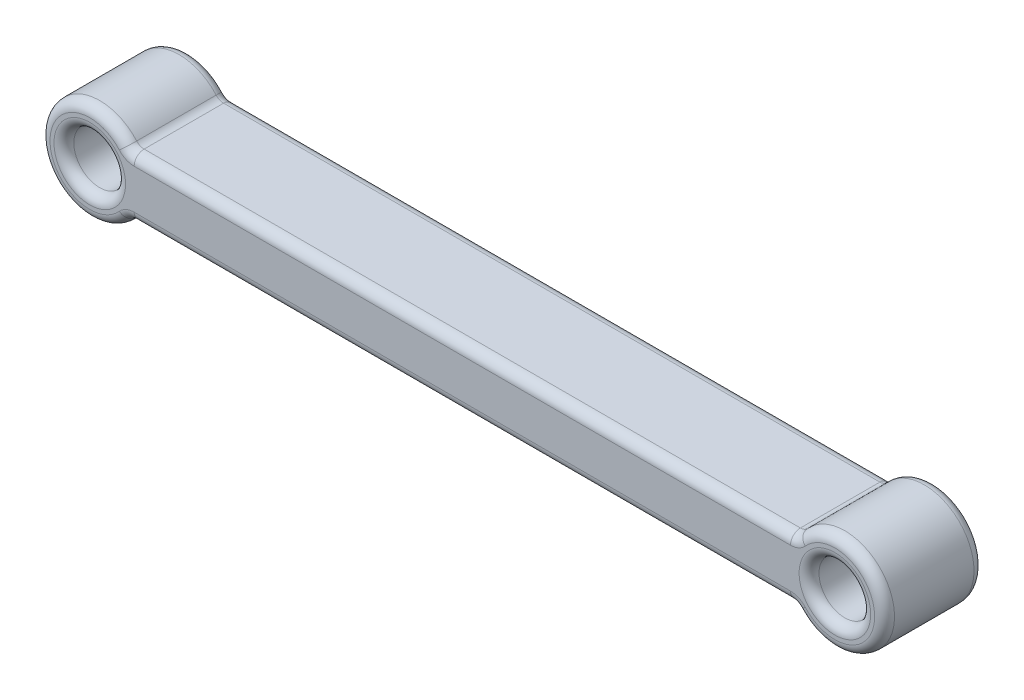
ISO-10303-21;
HEADER;
FILE_DESCRIPTION(('STEP AP214'),'2;1');
FILE_NAME('part.step','',(''),(''),'','','');
FILE_SCHEMA(('AUTOMOTIVE_DESIGN { 1 0 10303 214 1 1 1 1 }'));
ENDSEC;
DATA;
#1=APPLICATION_CONTEXT('core data for automotive mechanical design processes');
#2=APPLICATION_PROTOCOL_DEFINITION('international standard','automotive_design',2000,#1);
#3=PRODUCT_CONTEXT('',#1,'mechanical');
#4=PRODUCT('Part','Part','',(#3));
#5=PRODUCT_RELATED_PRODUCT_CATEGORY('part','',(#4));
#6=PRODUCT_DEFINITION_FORMATION('','',#4);
#7=PRODUCT_DEFINITION_CONTEXT('part definition',#1,'design');
#8=PRODUCT_DEFINITION('design','',#6,#7);
#9=PRODUCT_DEFINITION_SHAPE('','',#8);
#10=(LENGTH_UNIT() NAMED_UNIT(*) SI_UNIT(.MILLI.,.METRE.));
#11=(NAMED_UNIT(*) PLANE_ANGLE_UNIT() SI_UNIT($,.RADIAN.));
#12=(NAMED_UNIT(*) SI_UNIT($,.STERADIAN.) SOLID_ANGLE_UNIT());
#13=UNCERTAINTY_MEASURE_WITH_UNIT(LENGTH_MEASURE(1.E-05),#10,'distance_accuracy_value','');
#14=(GEOMETRIC_REPRESENTATION_CONTEXT(3) GLOBAL_UNCERTAINTY_ASSIGNED_CONTEXT((#13)) GLOBAL_UNIT_ASSIGNED_CONTEXT((#10,
#11,#12)) REPRESENTATION_CONTEXT('',''));
#15=CARTESIAN_POINT('',(0.,0.,0.));
#16=DIRECTION('',(0.,0.,1.));
#17=DIRECTION('',(1.,0.,0.));
#18=AXIS2_PLACEMENT_3D('',#15,#16,#17);
#19=CARTESIAN_POINT('',(-75.,0.,10.));
#20=DIRECTION('',(0.,0.,1.));
#21=DIRECTION('',(1.,0.,0.));
#22=AXIS2_PLACEMENT_3D('',#19,#20,#21);
#23=PLANE('',#22);
#24=CARTESIAN_POINT('',(0.,0.,10.));
#25=DIRECTION('',(0.,0.,1.));
#26=DIRECTION('',(1.,0.,0.));
#27=AXIS2_PLACEMENT_3D('',#24,#25,#26);
#28=CIRCLE('',#27,3.6);
#29=CARTESIAN_POINT('',(3.6,0.,10.));
#30=VERTEX_POINT('',#29);
#31=EDGE_CURVE('E11',#30,#30,#28,.F.);
#32=ORIENTED_EDGE('',*,*,#31,.T.);
#33=EDGE_LOOP('',(#32));
#34=FACE_BOUND('',#33,.T.);
#35=CARTESIAN_POINT('',(-4.47213595499957,-4.00000000000001,10.));
#36=DIRECTION('',(0.,0.,1.));
#37=DIRECTION('',(1.,0.,0.));
#38=AXIS2_PLACEMENT_3D('',#35,#36,#37);
#39=CIRCLE('',#38,2.);
#40=CARTESIAN_POINT('',(-2.98142396999971,-2.66666666666667,10.));
#41=VERTEX_POINT('',#40);
#42=CARTESIAN_POINT('',(-4.47213595499957,-2.00000000000001,10.));
#43=VERTEX_POINT('',#42);
#44=EDGE_CURVE('E63',#41,#43,#39,.T.);
#45=ORIENTED_EDGE('',*,*,#44,.F.);
#46=CARTESIAN_POINT('',(0.,0.,10.));
#47=DIRECTION('',(0.,0.,1.));
#48=DIRECTION('',(1.,0.,0.));
#49=AXIS2_PLACEMENT_3D('',#46,#47,#48);
#50=CIRCLE('',#49,4.);
#51=CARTESIAN_POINT('',(-2.98142396999972,2.66666666666666,10.));
#52=VERTEX_POINT('',#51);
#53=EDGE_CURVE('E51',#41,#52,#50,.T.);
#54=ORIENTED_EDGE('',*,*,#53,.T.);
#55=CARTESIAN_POINT('',(-4.47213595499959,3.99999999999999,10.));
#56=DIRECTION('',(0.,0.,1.));
#57=DIRECTION('',(1.,0.,0.));
#58=AXIS2_PLACEMENT_3D('',#55,#56,#57);
#59=CIRCLE('',#58,2.);
#60=CARTESIAN_POINT('',(-4.47213595499959,1.99999999999999,10.));
#61=VERTEX_POINT('',#60);
#62=EDGE_CURVE('E319',#61,#52,#59,.T.);
#63=ORIENTED_EDGE('',*,*,#62,.F.);
#64=DIRECTION('',(-1.,0.,0.));
#65=VECTOR('',#64,1.);
#66=CARTESIAN_POINT('',(-71.,1.99999999999999,10.));
#67=LINE('',#66,#65);
#68=CARTESIAN_POINT('',(-70.5278640450004,1.99999999999999,10.));
#69=VERTEX_POINT('',#68);
#70=EDGE_CURVE('E314',#61,#69,#67,.T.);
#71=ORIENTED_EDGE('',*,*,#70,.T.);
#72=CARTESIAN_POINT('',(-70.5278640450004,3.99999999999999,10.));
#73=DIRECTION('',(0.,0.,1.));
#74=DIRECTION('',(1.,0.,0.));
#75=AXIS2_PLACEMENT_3D('',#72,#73,#74);
#76=CIRCLE('',#75,2.);
#77=CARTESIAN_POINT('',(-72.0185760300003,2.66666666666666,10.));
#78=VERTEX_POINT('',#77);
#79=EDGE_CURVE('E186',#78,#69,#76,.T.);
#80=ORIENTED_EDGE('',*,*,#79,.F.);
#81=CARTESIAN_POINT('',(-75.,0.,10.));
#82=DIRECTION('',(0.,0.,1.));
#83=DIRECTION('',(1.,0.,0.));
#84=AXIS2_PLACEMENT_3D('',#81,#82,#83);
#85=CIRCLE('',#84,4.);
#86=CARTESIAN_POINT('',(-72.0185760300003,-2.66666666666667,10.));
#87=VERTEX_POINT('',#86);
#88=EDGE_CURVE('E306',#78,#87,#85,.T.);
#89=ORIENTED_EDGE('',*,*,#88,.T.);
#90=CARTESIAN_POINT('',(-70.5278640450004,-4.00000000000001,10.));
#91=DIRECTION('',(0.,0.,1.));
#92=DIRECTION('',(1.,0.,0.));
#93=AXIS2_PLACEMENT_3D('',#90,#91,#92);
#94=CIRCLE('',#93,2.);
#95=CARTESIAN_POINT('',(-70.5278640450004,-2.00000000000001,10.));
#96=VERTEX_POINT('',#95);
#97=EDGE_CURVE('E302',#96,#87,#94,.T.);
#98=ORIENTED_EDGE('',*,*,#97,.F.);
#99=DIRECTION('',(1.,0.,0.));
#100=VECTOR('',#99,1.);
#101=CARTESIAN_POINT('',(-3.99999999999999,-2.00000000000001,10.));
#102=LINE('',#101,#100);
#103=EDGE_CURVE('E309',#96,#43,#102,.T.);
#104=ORIENTED_EDGE('',*,*,#103,.T.);
#105=EDGE_LOOP('',(#45,#54,#63,#71,#80,#89,#98,#104));
#106=FACE_BOUND('',#105,.T.);
#107=CARTESIAN_POINT('',(-75.,0.,10.));
#108=DIRECTION('',(0.,0.,1.));
#109=DIRECTION('',(1.,0.,0.));
#110=AXIS2_PLACEMENT_3D('',#107,#108,#109);
#111=CIRCLE('',#110,3.6);
#112=CARTESIAN_POINT('',(-71.4,0.,10.));
#113=VERTEX_POINT('',#112);
#114=EDGE_CURVE('E298',#113,#113,#111,.F.);
#115=ORIENTED_EDGE('',*,*,#114,.T.);
#116=EDGE_LOOP('',(#115));
#117=FACE_BOUND('',#116,.T.);
#118=ADVANCED_FACE('F41',(#34,#106,#117),#23,.T.);
#119=CARTESIAN_POINT('',(-75.,0.,0.));
#120=DIRECTION('',(0.,0.,1.));
#121=DIRECTION('',(1.,0.,0.));
#122=AXIS2_PLACEMENT_3D('',#119,#120,#121);
#123=PLANE('',#122);
#124=CARTESIAN_POINT('',(0.,0.,0.));
#125=DIRECTION('',(0.,0.,1.));
#126=DIRECTION('',(1.,0.,0.));
#127=AXIS2_PLACEMENT_3D('',#124,#125,#126);
#128=CIRCLE('',#127,3.6);
#129=CARTESIAN_POINT('',(3.6,0.,0.));
#130=VERTEX_POINT('',#129);
#131=EDGE_CURVE('E278',#130,#130,#128,.T.);
#132=ORIENTED_EDGE('',*,*,#131,.T.);
#133=EDGE_LOOP('',(#132));
#134=FACE_BOUND('',#133,.T.);
#135=CARTESIAN_POINT('',(-75.,0.,0.));
#136=DIRECTION('',(0.,0.,1.));
#137=DIRECTION('',(1.,0.,0.));
#138=AXIS2_PLACEMENT_3D('',#135,#136,#137);
#139=CIRCLE('',#138,3.6);
#140=CARTESIAN_POINT('',(-71.4,0.,0.));
#141=VERTEX_POINT('',#140);
#142=EDGE_CURVE('E274',#141,#141,#139,.T.);
#143=ORIENTED_EDGE('',*,*,#142,.T.);
#144=EDGE_LOOP('',(#143));
#145=FACE_BOUND('',#144,.T.);
#146=CARTESIAN_POINT('',(-4.47213595499959,3.99999999999999,0.));
#147=DIRECTION('',(0.,0.,1.));
#148=DIRECTION('',(1.,0.,0.));
#149=AXIS2_PLACEMENT_3D('',#146,#147,#148);
#150=CIRCLE('',#149,2.);
#151=CARTESIAN_POINT('',(-2.98142396999972,2.66666666666666,0.));
#152=VERTEX_POINT('',#151);
#153=CARTESIAN_POINT('',(-4.47213595499959,1.99999999999999,0.));
#154=VERTEX_POINT('',#153);
#155=EDGE_CURVE('E263',#152,#154,#150,.F.);
#156=ORIENTED_EDGE('',*,*,#155,.F.);
#157=CARTESIAN_POINT('',(0.,0.,0.));
#158=DIRECTION('',(0.,0.,1.));
#159=DIRECTION('',(1.,0.,0.));
#160=AXIS2_PLACEMENT_3D('',#157,#158,#159);
#161=CIRCLE('',#160,4.);
#162=CARTESIAN_POINT('',(-2.98142396999971,-2.66666666666667,0.));
#163=VERTEX_POINT('',#162);
#164=EDGE_CURVE('E271',#152,#163,#161,.F.);
#165=ORIENTED_EDGE('',*,*,#164,.T.);
#166=CARTESIAN_POINT('',(-4.47213595499957,-4.00000000000001,0.));
#167=DIRECTION('',(0.,0.,1.));
#168=DIRECTION('',(1.,0.,0.));
#169=AXIS2_PLACEMENT_3D('',#166,#167,#168);
#170=CIRCLE('',#169,2.);
#171=CARTESIAN_POINT('',(-4.47213595499957,-2.00000000000001,0.));
#172=VERTEX_POINT('',#171);
#173=EDGE_CURVE('E267',#172,#163,#170,.F.);
#174=ORIENTED_EDGE('',*,*,#173,.F.);
#175=DIRECTION('',(1.,0.,0.));
#176=VECTOR('',#175,1.);
#177=CARTESIAN_POINT('',(-75.,-2.00000000000001,0.));
#178=LINE('',#177,#176);
#179=CARTESIAN_POINT('',(-70.5278640450004,-2.00000000000001,0.));
#180=VERTEX_POINT('',#179);
#181=EDGE_CURVE('E259',#172,#180,#178,.F.);
#182=ORIENTED_EDGE('',*,*,#181,.T.);
#183=CARTESIAN_POINT('',(-70.5278640450004,-4.00000000000001,0.));
#184=DIRECTION('',(0.,0.,1.));
#185=DIRECTION('',(1.,0.,0.));
#186=AXIS2_PLACEMENT_3D('',#183,#184,#185);
#187=CIRCLE('',#186,2.);
#188=CARTESIAN_POINT('',(-72.0185760300003,-2.66666666666667,0.));
#189=VERTEX_POINT('',#188);
#190=EDGE_CURVE('E255',#189,#180,#187,.F.);
#191=ORIENTED_EDGE('',*,*,#190,.F.);
#192=CARTESIAN_POINT('',(-75.,0.,0.));
#193=DIRECTION('',(0.,0.,1.));
#194=DIRECTION('',(1.,0.,0.));
#195=AXIS2_PLACEMENT_3D('',#192,#193,#194);
#196=CIRCLE('',#195,4.);
#197=CARTESIAN_POINT('',(-72.0185760300003,2.66666666666666,0.));
#198=VERTEX_POINT('',#197);
#199=EDGE_CURVE('E249',#189,#198,#196,.F.);
#200=ORIENTED_EDGE('',*,*,#199,.T.);
#201=CARTESIAN_POINT('',(-70.5278640450004,3.99999999999999,0.));
#202=DIRECTION('',(0.,0.,1.));
#203=DIRECTION('',(1.,0.,0.));
#204=AXIS2_PLACEMENT_3D('',#201,#202,#203);
#205=CIRCLE('',#204,2.);
#206=CARTESIAN_POINT('',(-70.5278640450004,1.99999999999999,0.));
#207=VERTEX_POINT('',#206);
#208=EDGE_CURVE('E245',#207,#198,#205,.F.);
#209=ORIENTED_EDGE('',*,*,#208,.F.);
#210=DIRECTION('',(-1.,0.,0.));
#211=VECTOR('',#210,1.);
#212=CARTESIAN_POINT('',(-75.,1.99999999999999,0.));
#213=LINE('',#212,#211);
#214=EDGE_CURVE('E252',#207,#154,#213,.F.);
#215=ORIENTED_EDGE('',*,*,#214,.T.);
#216=EDGE_LOOP('',(#156,#165,#174,#182,#191,#200,#209,#215));
#217=FACE_BOUND('',#216,.T.);
#218=ADVANCED_FACE('F408',(#134,#145,#217),#123,.F.);
#219=CARTESIAN_POINT('',(-75.,0.,10.));
#220=DIRECTION('',(0.,0.,-1.));
#221=DIRECTION('',(-1.,0.,0.));
#222=AXIS2_PLACEMENT_3D('',#219,#220,#221);
#223=CYLINDRICAL_SURFACE('',#222,5.);
#224=DIRECTION('',(0.,0.,-1.));
#225=VECTOR('',#224,1.);
#226=CARTESIAN_POINT('',(-71.2732200375003,3.33333333333332,10.));
#227=LINE('',#226,#225);
#228=CARTESIAN_POINT('',(-71.2732200375003,3.33333333333332,9.));
#229=VERTEX_POINT('',#228);
#230=CARTESIAN_POINT('',(-71.2732200375003,3.33333333333332,0.999999999999999));
#231=VERTEX_POINT('',#230);
#232=EDGE_CURVE('E175',#229,#231,#227,.T.);
#233=ORIENTED_EDGE('',*,*,#232,.T.);
#234=CARTESIAN_POINT('',(-75.,0.,0.999999999999999));
#235=DIRECTION('',(0.,0.,1.));
#236=DIRECTION('',(1.,0.,0.));
#237=AXIS2_PLACEMENT_3D('',#234,#235,#236);
#238=CIRCLE('',#237,5.);
#239=CARTESIAN_POINT('',(-71.2732200375004,-3.33333333333334,0.999999999999999));
#240=VERTEX_POINT('',#239);
#241=EDGE_CURVE('E229',#231,#240,#238,.T.);
#242=ORIENTED_EDGE('',*,*,#241,.T.);
#243=DIRECTION('',(0.,0.,-1.));
#244=VECTOR('',#243,1.);
#245=CARTESIAN_POINT('',(-71.2732200375004,-3.33333333333334,10.));
#246=LINE('',#245,#244);
#247=CARTESIAN_POINT('',(-71.2732200375004,-3.33333333333334,9.));
#248=VERTEX_POINT('',#247);
#249=EDGE_CURVE('E224',#240,#248,#246,.F.);
#250=ORIENTED_EDGE('',*,*,#249,.T.);
#251=CARTESIAN_POINT('',(-75.,0.,9.));
#252=DIRECTION('',(0.,0.,1.));
#253=DIRECTION('',(1.,0.,0.));
#254=AXIS2_PLACEMENT_3D('',#251,#252,#253);
#255=CIRCLE('',#254,5.);
#256=EDGE_CURVE('E221',#248,#229,#255,.F.);
#257=ORIENTED_EDGE('',*,*,#256,.T.);
#258=EDGE_LOOP('',(#233,#242,#250,#257));
#259=FACE_BOUND('',#258,.T.);
#260=ADVANCED_FACE('F439',(#259),#223,.T.);
#261=CARTESIAN_POINT('',(-71.,-3.00000000000001,10.));
#262=DIRECTION('',(0.,1.,0.));
#263=DIRECTION('',(0.,0.,1.));
#264=AXIS2_PLACEMENT_3D('',#261,#262,#263);
#265=PLANE('',#264);
#266=DIRECTION('',(0.,0.,1.));
#267=VECTOR('',#266,1.);
#268=CARTESIAN_POINT('',(-70.5278640450004,-3.00000000000001,0.));
#269=LINE('',#268,#267);
#270=CARTESIAN_POINT('',(-70.5278640450004,-3.00000000000001,9.));
#271=VERTEX_POINT('',#270);
#272=CARTESIAN_POINT('',(-70.5278640450004,-3.00000000000001,0.999999999999999));
#273=VERTEX_POINT('',#272);
#274=EDGE_CURVE('E238',#271,#273,#269,.F.);
#275=ORIENTED_EDGE('',*,*,#274,.T.);
#276=DIRECTION('',(1.,0.,0.));
#277=VECTOR('',#276,1.);
#278=CARTESIAN_POINT('',(-71.,-3.00000000000001,0.999999999999999));
#279=LINE('',#278,#277);
#280=CARTESIAN_POINT('',(-4.47213595499957,-3.00000000000001,0.999999999999999));
#281=VERTEX_POINT('',#280);
#282=EDGE_CURVE('E242',#273,#281,#279,.T.);
#283=ORIENTED_EDGE('',*,*,#282,.T.);
#284=DIRECTION('',(0.,0.,1.));
#285=VECTOR('',#284,1.);
#286=CARTESIAN_POINT('',(-4.47213595499957,-3.00000000000001,10.));
#287=LINE('',#286,#285);
#288=CARTESIAN_POINT('',(-4.47213595499957,-3.00000000000001,9.));
#289=VERTEX_POINT('',#288);
#290=EDGE_CURVE('E235',#281,#289,#287,.T.);
#291=ORIENTED_EDGE('',*,*,#290,.T.);
#292=DIRECTION('',(1.,0.,0.));
#293=VECTOR('',#292,1.);
#294=CARTESIAN_POINT('',(-71.,-3.00000000000001,9.));
#295=LINE('',#294,#293);
#296=EDGE_CURVE('E232',#289,#271,#295,.F.);
#297=ORIENTED_EDGE('',*,*,#296,.T.);
#298=EDGE_LOOP('',(#275,#283,#291,#297));
#299=FACE_BOUND('',#298,.T.);
#300=ADVANCED_FACE('F426',(#299),#265,.F.);
#301=CARTESIAN_POINT('',(0.,0.,10.));
#302=DIRECTION('',(0.,0.,-1.));
#303=DIRECTION('',(-1.,0.,0.));
#304=AXIS2_PLACEMENT_3D('',#301,#302,#303);
#305=CYLINDRICAL_SURFACE('',#304,5.);
#306=DIRECTION('',(0.,0.,-1.));
#307=VECTOR('',#306,1.);
#308=CARTESIAN_POINT('',(-3.72677996249964,-3.33333333333334,10.));
#309=LINE('',#308,#307);
#310=CARTESIAN_POINT('',(-3.72677996249964,-3.33333333333334,9.));
#311=VERTEX_POINT('',#310);
#312=CARTESIAN_POINT('',(-3.72677996249964,-3.33333333333334,0.999999999999999));
#313=VERTEX_POINT('',#312);
#314=EDGE_CURVE('E211',#311,#313,#309,.T.);
#315=ORIENTED_EDGE('',*,*,#314,.T.);
#316=CARTESIAN_POINT('',(0.,0.,0.999999999999999));
#317=DIRECTION('',(0.,0.,1.));
#318=DIRECTION('',(1.,0.,0.));
#319=AXIS2_PLACEMENT_3D('',#316,#317,#318);
#320=CIRCLE('',#319,5.);
#321=CARTESIAN_POINT('',(-3.72677996249966,3.33333333333333,0.999999999999999));
#322=VERTEX_POINT('',#321);
#323=EDGE_CURVE('E218',#313,#322,#320,.T.);
#324=ORIENTED_EDGE('',*,*,#323,.T.);
#325=DIRECTION('',(0.,0.,-1.));
#326=VECTOR('',#325,1.);
#327=CARTESIAN_POINT('',(-3.72677996249966,3.33333333333333,10.));
#328=LINE('',#327,#326);
#329=CARTESIAN_POINT('',(-3.72677996249966,3.33333333333333,9.));
#330=VERTEX_POINT('',#329);
#331=EDGE_CURVE('E214',#322,#330,#328,.F.);
#332=ORIENTED_EDGE('',*,*,#331,.T.);
#333=CARTESIAN_POINT('',(0.,0.,9.));
#334=DIRECTION('',(0.,0.,1.));
#335=DIRECTION('',(1.,0.,0.));
#336=AXIS2_PLACEMENT_3D('',#333,#334,#335);
#337=CIRCLE('',#336,5.);
#338=EDGE_CURVE('E208',#330,#311,#337,.F.);
#339=ORIENTED_EDGE('',*,*,#338,.T.);
#340=EDGE_LOOP('',(#315,#324,#332,#339));
#341=FACE_BOUND('',#340,.T.);
#342=ADVANCED_FACE('F484',(#341),#305,.T.);
#343=CARTESIAN_POINT('',(-71.,2.99999999999999,10.));
#344=DIRECTION('',(0.,-1.,0.));
#345=DIRECTION('',(0.,0.,-1.));
#346=AXIS2_PLACEMENT_3D('',#343,#344,#345);
#347=PLANE('',#346);
#348=DIRECTION('',(0.,0.,1.));
#349=VECTOR('',#348,1.);
#350=CARTESIAN_POINT('',(-4.47213595499959,2.99999999999999,0.));
#351=LINE('',#350,#349);
#352=CARTESIAN_POINT('',(-4.47213595499959,2.99999999999999,9.));
#353=VERTEX_POINT('',#352);
#354=CARTESIAN_POINT('',(-4.47213595499959,2.99999999999999,0.999999999999999));
#355=VERTEX_POINT('',#354);
#356=EDGE_CURVE('E167',#353,#355,#351,.F.);
#357=ORIENTED_EDGE('',*,*,#356,.T.);
#358=DIRECTION('',(-1.,0.,0.));
#359=VECTOR('',#358,1.);
#360=CARTESIAN_POINT('',(-71.,2.99999999999999,0.999999999999999));
#361=LINE('',#360,#359);
#362=CARTESIAN_POINT('',(-70.5278640450004,2.99999999999999,0.999999999999999));
#363=VERTEX_POINT('',#362);
#364=EDGE_CURVE('E162',#355,#363,#361,.T.);
#365=ORIENTED_EDGE('',*,*,#364,.T.);
#366=DIRECTION('',(0.,0.,1.));
#367=VECTOR('',#366,1.);
#368=CARTESIAN_POINT('',(-70.5278640450004,2.99999999999999,10.));
#369=LINE('',#368,#367);
#370=CARTESIAN_POINT('',(-70.5278640450004,2.99999999999999,9.));
#371=VERTEX_POINT('',#370);
#372=EDGE_CURVE('E154',#363,#371,#369,.T.);
#373=ORIENTED_EDGE('',*,*,#372,.T.);
#374=DIRECTION('',(-1.,0.,0.));
#375=VECTOR('',#374,1.);
#376=CARTESIAN_POINT('',(-4.,2.99999999999999,9.));
#377=LINE('',#376,#375);
#378=EDGE_CURVE('E159',#371,#353,#377,.F.);
#379=ORIENTED_EDGE('',*,*,#378,.T.);
#380=EDGE_LOOP('',(#357,#365,#373,#379));
#381=FACE_BOUND('',#380,.T.);
#382=ADVANCED_FACE('F157',(#381),#347,.F.);
#383=CARTESIAN_POINT('',(-75.,0.,10.));
#384=DIRECTION('',(0.,0.,-1.));
#385=DIRECTION('',(-1.,0.,0.));
#386=AXIS2_PLACEMENT_3D('',#383,#384,#385);
#387=CYLINDRICAL_SURFACE('',#386,2.6);
#388=CARTESIAN_POINT('',(-75.,0.,0.999999999999999));
#389=DIRECTION('',(0.,0.,1.));
#390=DIRECTION('',(1.,0.,0.));
#391=AXIS2_PLACEMENT_3D('',#388,#389,#390);
#392=CIRCLE('',#391,2.6);
#393=CARTESIAN_POINT('',(-72.4,0.,0.999999999999999));
#394=VERTEX_POINT('',#393);
#395=EDGE_CURVE('E294',#394,#394,#392,.F.);
#396=ORIENTED_EDGE('',*,*,#395,.T.);
#397=EDGE_LOOP('',(#396));
#398=FACE_BOUND('',#397,.T.);
#399=CARTESIAN_POINT('',(-75.,0.,9.));
#400=DIRECTION('',(0.,0.,1.));
#401=DIRECTION('',(1.,0.,0.));
#402=AXIS2_PLACEMENT_3D('',#399,#400,#401);
#403=CIRCLE('',#402,2.6);
#404=CARTESIAN_POINT('',(-72.4,0.,9.));
#405=VERTEX_POINT('',#404);
#406=EDGE_CURVE('E290',#405,#405,#403,.T.);
#407=ORIENTED_EDGE('',*,*,#406,.T.);
#408=EDGE_LOOP('',(#407));
#409=FACE_BOUND('',#408,.T.);
#410=ADVANCED_FACE('F479',(#398,#409),#387,.F.);
#411=CARTESIAN_POINT('',(0.,0.,10.));
#412=DIRECTION('',(0.,0.,-1.));
#413=DIRECTION('',(-1.,0.,0.));
#414=AXIS2_PLACEMENT_3D('',#411,#412,#413);
#415=CYLINDRICAL_SURFACE('',#414,2.6);
#416=CARTESIAN_POINT('',(0.,0.,0.999999999999999));
#417=DIRECTION('',(0.,0.,1.));
#418=DIRECTION('',(1.,0.,0.));
#419=AXIS2_PLACEMENT_3D('',#416,#417,#418);
#420=CIRCLE('',#419,2.6);
#421=CARTESIAN_POINT('',(2.6,0.,0.999999999999999));
#422=VERTEX_POINT('',#421);
#423=EDGE_CURVE('E286',#422,#422,#420,.F.);
#424=ORIENTED_EDGE('',*,*,#423,.T.);
#425=EDGE_LOOP('',(#424));
#426=FACE_BOUND('',#425,.T.);
#427=CARTESIAN_POINT('',(0.,0.,9.));
#428=DIRECTION('',(0.,0.,1.));
#429=DIRECTION('',(1.,0.,0.));
#430=AXIS2_PLACEMENT_3D('',#427,#428,#429);
#431=CIRCLE('',#430,2.6);
#432=CARTESIAN_POINT('',(2.6,0.,9.));
#433=VERTEX_POINT('',#432);
#434=EDGE_CURVE('E282',#433,#433,#431,.T.);
#435=ORIENTED_EDGE('',*,*,#434,.T.);
#436=EDGE_LOOP('',(#435));
#437=FACE_BOUND('',#436,.T.);
#438=ADVANCED_FACE('F535',(#426,#437),#415,.F.);
#439=CARTESIAN_POINT('',(-70.5278640450004,-4.00000000000001,10.));
#440=DIRECTION('',(0.,0.,-1.));
#441=DIRECTION('',(-1.,0.,0.));
#442=AXIS2_PLACEMENT_3D('',#439,#440,#441);
#443=CYLINDRICAL_SURFACE('',#442,1.);
#444=CARTESIAN_POINT('',(-70.5278640450004,-4.00000000000001,9.));
#445=DIRECTION('',(0.,0.,1.));
#446=DIRECTION('',(1.,0.,0.));
#447=AXIS2_PLACEMENT_3D('',#444,#445,#446);
#448=CIRCLE('',#447,1.);
#449=EDGE_CURVE('E45',#248,#271,#448,.F.);
#450=ORIENTED_EDGE('',*,*,#449,.F.);
#451=ORIENTED_EDGE('',*,*,#249,.F.);
#452=CARTESIAN_POINT('',(-70.5278640450004,-4.00000000000001,0.999999999999999));
#453=DIRECTION('',(0.,0.,1.));
#454=DIRECTION('',(1.,0.,0.));
#455=AXIS2_PLACEMENT_3D('',#452,#453,#454);
#456=CIRCLE('',#455,1.);
#457=EDGE_CURVE('E202',#273,#240,#456,.T.);
#458=ORIENTED_EDGE('',*,*,#457,.F.);
#459=ORIENTED_EDGE('',*,*,#274,.F.);
#460=EDGE_LOOP('',(#450,#451,#458,#459));
#461=FACE_BOUND('',#460,.T.);
#462=ADVANCED_FACE('F437',(#461),#443,.F.);
#463=CARTESIAN_POINT('',(-70.5278640450004,-4.00000000000001,9.));
#464=DIRECTION('',(0.,0.,1.));
#465=DIRECTION('',(1.,0.,0.));
#466=AXIS2_PLACEMENT_3D('',#463,#464,#465);
#467=TOROIDAL_SURFACE('',#466,2.,1.);
#468=CARTESIAN_POINT('',(-72.0185760300003,-2.66666666666667,9.));
#469=DIRECTION('',(0.666666666666665,0.745355992499931,0.));
#470=DIRECTION('',(-0.745355992499932,0.666666666666665,0.));
#471=AXIS2_PLACEMENT_3D('',#468,#469,#470);
#472=CIRCLE('',#471,1.);
#473=EDGE_CURVE('E385',#248,#87,#472,.F.);
#474=ORIENTED_EDGE('',*,*,#473,.F.);
#475=ORIENTED_EDGE('',*,*,#449,.T.);
#476=CARTESIAN_POINT('',(-70.5278640450004,-2.00000000000001,9.));
#477=DIRECTION('',(-1.,0.,0.));
#478=DIRECTION('',(0.,0.,1.));
#479=AXIS2_PLACEMENT_3D('',#476,#477,#478);
#480=CIRCLE('',#479,1.);
#481=EDGE_CURVE('E389',#96,#271,#480,.F.);
#482=ORIENTED_EDGE('',*,*,#481,.F.);
#483=ORIENTED_EDGE('',*,*,#97,.T.);
#484=EDGE_LOOP('',(#474,#475,#482,#483));
#485=FACE_BOUND('',#484,.T.);
#486=ADVANCED_FACE('F434',(#485),#467,.T.);
#487=CARTESIAN_POINT('',(-70.5278640450004,-4.00000000000001,0.999999999999999));
#488=DIRECTION('',(0.,0.,1.));
#489=DIRECTION('',(1.,0.,0.));
#490=AXIS2_PLACEMENT_3D('',#487,#488,#489);
#491=TOROIDAL_SURFACE('',#490,2.,1.);
#492=CARTESIAN_POINT('',(-70.5278640450004,-2.00000000000001,1.));
#493=DIRECTION('',(-1.,0.,0.));
#494=DIRECTION('',(0.,0.,1.));
#495=AXIS2_PLACEMENT_3D('',#492,#493,#494);
#496=CIRCLE('',#495,1.);
#497=EDGE_CURVE('E378',#273,#180,#496,.F.);
#498=ORIENTED_EDGE('',*,*,#497,.F.);
#499=ORIENTED_EDGE('',*,*,#457,.T.);
#500=CARTESIAN_POINT('',(-72.0185760300003,-2.66666666666667,0.999999999999999));
#501=DIRECTION('',(0.666666666666666,0.745355992499931,0.));
#502=DIRECTION('',(-0.745355992499931,0.666666666666666,0.));
#503=AXIS2_PLACEMENT_3D('',#500,#501,#502);
#504=CIRCLE('',#503,1.);
#505=EDGE_CURVE('E381',#189,#240,#504,.F.);
#506=ORIENTED_EDGE('',*,*,#505,.F.);
#507=ORIENTED_EDGE('',*,*,#190,.T.);
#508=EDGE_LOOP('',(#498,#499,#506,#507));
#509=FACE_BOUND('',#508,.T.);
#510=ADVANCED_FACE('F398',(#509),#491,.T.);
#511=CARTESIAN_POINT('',(-75.,-2.00000000000001,9.));
#512=DIRECTION('',(-1.,0.,0.));
#513=DIRECTION('',(0.,0.,1.));
#514=AXIS2_PLACEMENT_3D('',#511,#512,#513);
#515=CYLINDRICAL_SURFACE('',#514,1.);
#516=ORIENTED_EDGE('',*,*,#481,.T.);
#517=ORIENTED_EDGE('',*,*,#296,.F.);
#518=CARTESIAN_POINT('',(-4.47213595499957,-2.00000000000001,9.));
#519=DIRECTION('',(1.,0.,0.));
#520=DIRECTION('',(0.,0.,-1.));
#521=AXIS2_PLACEMENT_3D('',#518,#519,#520);
#522=CIRCLE('',#521,1.);
#523=EDGE_CURVE('E370',#43,#289,#522,.T.);
#524=ORIENTED_EDGE('',*,*,#523,.F.);
#525=ORIENTED_EDGE('',*,*,#103,.F.);
#526=EDGE_LOOP('',(#516,#517,#524,#525));
#527=FACE_BOUND('',#526,.T.);
#528=ADVANCED_FACE('F429',(#527),#515,.T.);
#529=CARTESIAN_POINT('',(-75.,0.,9.));
#530=DIRECTION('',(0.,0.,1.));
#531=DIRECTION('',(1.,0.,0.));
#532=AXIS2_PLACEMENT_3D('',#529,#530,#531);
#533=TOROIDAL_SURFACE('',#532,4.,1.);
#534=ORIENTED_EDGE('',*,*,#473,.T.);
#535=ORIENTED_EDGE('',*,*,#88,.F.);
#536=CARTESIAN_POINT('',(-72.0185760300003,2.66666666666666,9.));
#537=DIRECTION('',(0.666666666666664,-0.745355992499932,0.));
#538=DIRECTION('',(0.745355992499932,0.666666666666664,0.));
#539=AXIS2_PLACEMENT_3D('',#536,#537,#538);
#540=CIRCLE('',#539,1.);
#541=EDGE_CURVE('E180',#229,#78,#540,.T.);
#542=ORIENTED_EDGE('',*,*,#541,.F.);
#543=ORIENTED_EDGE('',*,*,#256,.F.);
#544=EDGE_LOOP('',(#534,#535,#542,#543));
#545=FACE_BOUND('',#544,.T.);
#546=ADVANCED_FACE('F441',(#545),#533,.T.);
#547=CARTESIAN_POINT('',(-70.5278640450004,3.99999999999999,10.));
#548=DIRECTION('',(0.,0.,-1.));
#549=DIRECTION('',(-1.,0.,0.));
#550=AXIS2_PLACEMENT_3D('',#547,#548,#549);
#551=CYLINDRICAL_SURFACE('',#550,1.);
#552=CARTESIAN_POINT('',(-70.5278640450004,3.99999999999999,0.999999999999999));
#553=DIRECTION('',(0.,0.,1.));
#554=DIRECTION('',(1.,0.,0.));
#555=AXIS2_PLACEMENT_3D('',#552,#553,#554);
#556=CIRCLE('',#555,1.);
#557=EDGE_CURVE('E181',#231,#363,#556,.T.);
#558=ORIENTED_EDGE('',*,*,#557,.F.);
#559=ORIENTED_EDGE('',*,*,#232,.F.);
#560=CARTESIAN_POINT('',(-70.5278640450004,3.99999999999999,9.));
#561=DIRECTION('',(0.,0.,1.));
#562=DIRECTION('',(1.,0.,0.));
#563=AXIS2_PLACEMENT_3D('',#560,#561,#562);
#564=CIRCLE('',#563,1.);
#565=EDGE_CURVE('E171',#371,#229,#564,.F.);
#566=ORIENTED_EDGE('',*,*,#565,.F.);
#567=ORIENTED_EDGE('',*,*,#372,.F.);
#568=EDGE_LOOP('',(#558,#559,#566,#567));
#569=FACE_BOUND('',#568,.T.);
#570=ADVANCED_FACE('F173',(#569),#551,.F.);
#571=CARTESIAN_POINT('',(-75.,0.,0.999999999999999));
#572=DIRECTION('',(0.,0.,1.));
#573=DIRECTION('',(1.,0.,0.));
#574=AXIS2_PLACEMENT_3D('',#571,#572,#573);
#575=TOROIDAL_SURFACE('',#574,4.,1.);
#576=ORIENTED_EDGE('',*,*,#505,.T.);
#577=ORIENTED_EDGE('',*,*,#241,.F.);
#578=CARTESIAN_POINT('',(-72.0185760300003,2.66666666666666,1.));
#579=DIRECTION('',(0.666666666666664,-0.745355992499933,0.));
#580=DIRECTION('',(0.745355992499933,0.666666666666664,0.));
#581=AXIS2_PLACEMENT_3D('',#578,#579,#580);
#582=CIRCLE('',#581,1.);
#583=EDGE_CURVE('E363',#198,#231,#582,.T.);
#584=ORIENTED_EDGE('',*,*,#583,.F.);
#585=ORIENTED_EDGE('',*,*,#199,.F.);
#586=EDGE_LOOP('',(#576,#577,#584,#585));
#587=FACE_BOUND('',#586,.T.);
#588=ADVANCED_FACE('F405',(#587),#575,.T.);
#589=CARTESIAN_POINT('',(-71.,-2.00000000000001,0.999999999999999));
#590=DIRECTION('',(1.,0.,0.));
#591=DIRECTION('',(0.,0.,-1.));
#592=AXIS2_PLACEMENT_3D('',#589,#590,#591);
#593=CYLINDRICAL_SURFACE('',#592,1.);
#594=ORIENTED_EDGE('',*,*,#497,.T.);
#595=ORIENTED_EDGE('',*,*,#181,.F.);
#596=CARTESIAN_POINT('',(-4.47213595499957,-2.00000000000001,0.999999999999999));
#597=DIRECTION('',(1.,0.,0.));
#598=DIRECTION('',(0.,0.,-1.));
#599=AXIS2_PLACEMENT_3D('',#596,#597,#598);
#600=CIRCLE('',#599,1.);
#601=EDGE_CURVE('E359',#281,#172,#600,.T.);
#602=ORIENTED_EDGE('',*,*,#601,.F.);
#603=ORIENTED_EDGE('',*,*,#282,.F.);
#604=EDGE_LOOP('',(#594,#595,#602,#603));
#605=FACE_BOUND('',#604,.T.);
#606=ADVANCED_FACE('F413',(#605),#593,.T.);
#607=CARTESIAN_POINT('',(-4.47213595499957,-4.00000000000001,10.));
#608=DIRECTION('',(0.,0.,-1.));
#609=DIRECTION('',(-1.,0.,0.));
#610=AXIS2_PLACEMENT_3D('',#607,#608,#609);
#611=CYLINDRICAL_SURFACE('',#610,1.);
#612=CARTESIAN_POINT('',(-4.47213595499957,-4.00000000000001,9.));
#613=DIRECTION('',(0.,0.,1.));
#614=DIRECTION('',(1.,0.,0.));
#615=AXIS2_PLACEMENT_3D('',#612,#613,#614);
#616=CIRCLE('',#615,1.);
#617=EDGE_CURVE('E374',#289,#311,#616,.F.);
#618=ORIENTED_EDGE('',*,*,#617,.F.);
#619=ORIENTED_EDGE('',*,*,#290,.F.);
#620=CARTESIAN_POINT('',(-4.47213595499957,-4.00000000000001,0.999999999999999));
#621=DIRECTION('',(0.,0.,1.));
#622=DIRECTION('',(1.,0.,0.));
#623=AXIS2_PLACEMENT_3D('',#620,#621,#622);
#624=CIRCLE('',#623,1.);
#625=EDGE_CURVE('E355',#313,#281,#624,.T.);
#626=ORIENTED_EDGE('',*,*,#625,.F.);
#627=ORIENTED_EDGE('',*,*,#314,.F.);
#628=EDGE_LOOP('',(#618,#619,#626,#627));
#629=FACE_BOUND('',#628,.T.);
#630=ADVANCED_FACE('F423',(#629),#611,.F.);
#631=CARTESIAN_POINT('',(-4.47213595499957,-4.00000000000001,9.));
#632=DIRECTION('',(0.,0.,1.));
#633=DIRECTION('',(1.,0.,0.));
#634=AXIS2_PLACEMENT_3D('',#631,#632,#633);
#635=TOROIDAL_SURFACE('',#634,2.,1.);
#636=ORIENTED_EDGE('',*,*,#523,.T.);
#637=ORIENTED_EDGE('',*,*,#617,.T.);
#638=CARTESIAN_POINT('',(-2.98142396999971,-2.66666666666667,9.));
#639=DIRECTION('',(-0.666666666666668,0.745355992499929,0.));
#640=DIRECTION('',(-0.745355992499929,-0.666666666666668,0.));
#641=AXIS2_PLACEMENT_3D('',#638,#639,#640);
#642=CIRCLE('',#641,1.);
#643=EDGE_CURVE('E191',#41,#311,#642,.F.);
#644=ORIENTED_EDGE('',*,*,#643,.F.);
#645=ORIENTED_EDGE('',*,*,#44,.T.);
#646=EDGE_LOOP('',(#636,#637,#644,#645));
#647=FACE_BOUND('',#646,.T.);
#648=ADVANCED_FACE('F468',(#647),#635,.T.);
#649=CARTESIAN_POINT('',(-70.5278640450004,3.99999999999999,9.));
#650=DIRECTION('',(0.,0.,1.));
#651=DIRECTION('',(1.,0.,0.));
#652=AXIS2_PLACEMENT_3D('',#649,#650,#651);
#653=TOROIDAL_SURFACE('',#652,2.,1.);
#654=ORIENTED_EDGE('',*,*,#541,.T.);
#655=ORIENTED_EDGE('',*,*,#79,.T.);
#656=CARTESIAN_POINT('',(-70.5278640450004,1.99999999999999,9.));
#657=DIRECTION('',(-1.,0.,0.));
#658=DIRECTION('',(0.,0.,1.));
#659=AXIS2_PLACEMENT_3D('',#656,#657,#658);
#660=CIRCLE('',#659,1.);
#661=EDGE_CURVE('E184',#371,#69,#660,.F.);
#662=ORIENTED_EDGE('',*,*,#661,.F.);
#663=ORIENTED_EDGE('',*,*,#565,.T.);
#664=EDGE_LOOP('',(#654,#655,#662,#663));
#665=FACE_BOUND('',#664,.T.);
#666=ADVANCED_FACE('F185',(#665),#653,.T.);
#667=CARTESIAN_POINT('',(-70.5278640450004,3.99999999999999,0.999999999999999));
#668=DIRECTION('',(0.,0.,1.));
#669=DIRECTION('',(1.,0.,0.));
#670=AXIS2_PLACEMENT_3D('',#667,#668,#669);
#671=TOROIDAL_SURFACE('',#670,2.,1.);
#672=ORIENTED_EDGE('',*,*,#583,.T.);
#673=ORIENTED_EDGE('',*,*,#557,.T.);
#674=CARTESIAN_POINT('',(-70.5278640450004,1.99999999999999,0.999999999999999));
#675=DIRECTION('',(-1.,0.,0.));
#676=DIRECTION('',(0.,0.,1.));
#677=AXIS2_PLACEMENT_3D('',#674,#675,#676);
#678=CIRCLE('',#677,1.);
#679=EDGE_CURVE('E192',#207,#363,#678,.F.);
#680=ORIENTED_EDGE('',*,*,#679,.F.);
#681=ORIENTED_EDGE('',*,*,#208,.T.);
#682=EDGE_LOOP('',(#672,#673,#680,#681));
#683=FACE_BOUND('',#682,.T.);
#684=ADVANCED_FACE('F459',(#683),#671,.T.);
#685=CARTESIAN_POINT('',(-4.47213595499957,-4.00000000000001,0.999999999999999));
#686=DIRECTION('',(0.,0.,1.));
#687=DIRECTION('',(1.,0.,0.));
#688=AXIS2_PLACEMENT_3D('',#685,#686,#687);
#689=TOROIDAL_SURFACE('',#688,2.,1.);
#690=ORIENTED_EDGE('',*,*,#601,.T.);
#691=ORIENTED_EDGE('',*,*,#173,.T.);
#692=CARTESIAN_POINT('',(-2.98142396999971,-2.66666666666667,1.));
#693=DIRECTION('',(-0.666666666666668,0.745355992499929,0.));
#694=DIRECTION('',(-0.745355992499929,-0.666666666666668,0.));
#695=AXIS2_PLACEMENT_3D('',#692,#693,#694);
#696=CIRCLE('',#695,1.);
#697=EDGE_CURVE('E345',#313,#163,#696,.F.);
#698=ORIENTED_EDGE('',*,*,#697,.F.);
#699=ORIENTED_EDGE('',*,*,#625,.T.);
#700=EDGE_LOOP('',(#690,#691,#698,#699));
#701=FACE_BOUND('',#700,.T.);
#702=ADVANCED_FACE('F415',(#701),#689,.T.);
#703=CARTESIAN_POINT('',(0.,0.,9.));
#704=DIRECTION('',(0.,0.,1.));
#705=DIRECTION('',(1.,0.,0.));
#706=AXIS2_PLACEMENT_3D('',#703,#704,#705);
#707=TOROIDAL_SURFACE('',#706,4.,1.);
#708=ORIENTED_EDGE('',*,*,#643,.T.);
#709=ORIENTED_EDGE('',*,*,#338,.F.);
#710=CARTESIAN_POINT('',(-2.98142396999972,2.66666666666666,9.));
#711=DIRECTION('',(-0.666666666666665,-0.745355992499931,0.));
#712=DIRECTION('',(0.745355992499931,-0.666666666666665,0.));
#713=AXIS2_PLACEMENT_3D('',#710,#711,#712);
#714=CIRCLE('',#713,1.);
#715=EDGE_CURVE('E341',#52,#330,#714,.T.);
#716=ORIENTED_EDGE('',*,*,#715,.F.);
#717=ORIENTED_EDGE('',*,*,#53,.F.);
#718=EDGE_LOOP('',(#708,#709,#716,#717));
#719=FACE_BOUND('',#718,.T.);
#720=ADVANCED_FACE('F466',(#719),#707,.T.);
#721=CARTESIAN_POINT('',(-75.,1.99999999999999,9.));
#722=DIRECTION('',(1.,0.,0.));
#723=DIRECTION('',(0.,0.,-1.));
#724=AXIS2_PLACEMENT_3D('',#721,#722,#723);
#725=CYLINDRICAL_SURFACE('',#724,1.);
#726=ORIENTED_EDGE('',*,*,#661,.T.);
#727=ORIENTED_EDGE('',*,*,#70,.F.);
#728=CARTESIAN_POINT('',(-4.47213595499959,1.99999999999999,9.));
#729=DIRECTION('',(1.,0.,0.));
#730=DIRECTION('',(0.,0.,-1.));
#731=AXIS2_PLACEMENT_3D('',#728,#729,#730);
#732=CIRCLE('',#731,1.);
#733=EDGE_CURVE('E196',#353,#61,#732,.T.);
#734=ORIENTED_EDGE('',*,*,#733,.F.);
#735=ORIENTED_EDGE('',*,*,#378,.F.);
#736=EDGE_LOOP('',(#726,#727,#734,#735));
#737=FACE_BOUND('',#736,.T.);
#738=ADVANCED_FACE('F194',(#737),#725,.T.);
#739=CARTESIAN_POINT('',(-71.,1.99999999999999,0.999999999999999));
#740=DIRECTION('',(-1.,0.,0.));
#741=DIRECTION('',(0.,0.,1.));
#742=AXIS2_PLACEMENT_3D('',#739,#740,#741);
#743=CYLINDRICAL_SURFACE('',#742,1.);
#744=ORIENTED_EDGE('',*,*,#679,.T.);
#745=ORIENTED_EDGE('',*,*,#364,.F.);
#746=CARTESIAN_POINT('',(-4.47213595499959,1.99999999999999,1.));
#747=DIRECTION('',(1.,0.,0.));
#748=DIRECTION('',(0.,0.,-1.));
#749=AXIS2_PLACEMENT_3D('',#746,#747,#748);
#750=CIRCLE('',#749,1.);
#751=EDGE_CURVE('E335',#154,#355,#750,.T.);
#752=ORIENTED_EDGE('',*,*,#751,.F.);
#753=ORIENTED_EDGE('',*,*,#214,.F.);
#754=EDGE_LOOP('',(#744,#745,#752,#753));
#755=FACE_BOUND('',#754,.T.);
#756=ADVANCED_FACE('F457',(#755),#743,.T.);
#757=CARTESIAN_POINT('',(0.,0.,0.999999999999999));
#758=DIRECTION('',(0.,0.,1.));
#759=DIRECTION('',(1.,0.,0.));
#760=AXIS2_PLACEMENT_3D('',#757,#758,#759);
#761=TOROIDAL_SURFACE('',#760,4.,1.);
#762=ORIENTED_EDGE('',*,*,#697,.T.);
#763=ORIENTED_EDGE('',*,*,#164,.F.);
#764=CARTESIAN_POINT('',(-2.98142396999972,2.66666666666666,0.999999999999999));
#765=DIRECTION('',(-0.666666666666665,-0.745355992499931,0.));
#766=DIRECTION('',(0.745355992499931,-0.666666666666665,0.));
#767=AXIS2_PLACEMENT_3D('',#764,#765,#766);
#768=CIRCLE('',#767,1.);
#769=EDGE_CURVE('E331',#322,#152,#768,.T.);
#770=ORIENTED_EDGE('',*,*,#769,.F.);
#771=ORIENTED_EDGE('',*,*,#323,.F.);
#772=EDGE_LOOP('',(#762,#763,#770,#771));
#773=FACE_BOUND('',#772,.T.);
#774=ADVANCED_FACE('F499',(#773),#761,.T.);
#775=CARTESIAN_POINT('',(-4.47213595499959,3.99999999999999,9.));
#776=DIRECTION('',(0.,0.,1.));
#777=DIRECTION('',(1.,0.,0.));
#778=AXIS2_PLACEMENT_3D('',#775,#776,#777);
#779=TOROIDAL_SURFACE('',#778,2.,1.);
#780=ORIENTED_EDGE('',*,*,#62,.T.);
#781=ORIENTED_EDGE('',*,*,#715,.T.);
#782=CARTESIAN_POINT('',(-4.47213595499959,3.99999999999999,9.));
#783=DIRECTION('',(0.,0.,1.));
#784=DIRECTION('',(1.,0.,0.));
#785=AXIS2_PLACEMENT_3D('',#782,#783,#784);
#786=CIRCLE('',#785,1.);
#787=EDGE_CURVE('E328',#353,#330,#786,.T.);
#788=ORIENTED_EDGE('',*,*,#787,.F.);
#789=ORIENTED_EDGE('',*,*,#733,.T.);
#790=EDGE_LOOP('',(#780,#781,#788,#789));
#791=FACE_BOUND('',#790,.T.);
#792=ADVANCED_FACE('F445',(#791),#779,.T.);
#793=CARTESIAN_POINT('',(-4.47213595499959,3.99999999999999,0.999999999999999));
#794=DIRECTION('',(0.,0.,1.));
#795=DIRECTION('',(1.,0.,0.));
#796=AXIS2_PLACEMENT_3D('',#793,#794,#795);
#797=TOROIDAL_SURFACE('',#796,2.,1.);
#798=ORIENTED_EDGE('',*,*,#155,.T.);
#799=ORIENTED_EDGE('',*,*,#751,.T.);
#800=CARTESIAN_POINT('',(-4.47213595499959,3.99999999999999,0.999999999999999));
#801=DIRECTION('',(0.,0.,1.));
#802=DIRECTION('',(1.,0.,0.));
#803=AXIS2_PLACEMENT_3D('',#800,#801,#802);
#804=CIRCLE('',#803,1.);
#805=EDGE_CURVE('E325',#322,#355,#804,.F.);
#806=ORIENTED_EDGE('',*,*,#805,.F.);
#807=ORIENTED_EDGE('',*,*,#769,.T.);
#808=EDGE_LOOP('',(#798,#799,#806,#807));
#809=FACE_BOUND('',#808,.T.);
#810=ADVANCED_FACE('F454',(#809),#797,.T.);
#811=CARTESIAN_POINT('',(-4.47213595499959,3.99999999999999,10.));
#812=DIRECTION('',(0.,0.,-1.));
#813=DIRECTION('',(-1.,0.,0.));
#814=AXIS2_PLACEMENT_3D('',#811,#812,#813);
#815=CYLINDRICAL_SURFACE('',#814,1.);
#816=ORIENTED_EDGE('',*,*,#787,.T.);
#817=ORIENTED_EDGE('',*,*,#331,.F.);
#818=ORIENTED_EDGE('',*,*,#805,.T.);
#819=ORIENTED_EDGE('',*,*,#356,.F.);
#820=EDGE_LOOP('',(#816,#817,#818,#819));
#821=FACE_BOUND('',#820,.T.);
#822=ADVANCED_FACE('F450',(#821),#815,.F.);
#823=CARTESIAN_POINT('',(0.,0.,0.999999999999999));
#824=DIRECTION('',(0.,0.,1.));
#825=DIRECTION('',(1.,0.,0.));
#826=AXIS2_PLACEMENT_3D('',#823,#824,#825);
#827=TOROIDAL_SURFACE('',#826,3.6,1.);
#828=ORIENTED_EDGE('',*,*,#423,.F.);
#829=EDGE_LOOP('',(#828));
#830=FACE_BOUND('',#829,.T.);
#831=ORIENTED_EDGE('',*,*,#131,.F.);
#832=EDGE_LOOP('',(#831));
#833=FACE_BOUND('',#832,.T.);
#834=ADVANCED_FACE('F494',(#830,#833),#827,.T.);
#835=CARTESIAN_POINT('',(-75.,0.,0.999999999999999));
#836=DIRECTION('',(0.,0.,1.));
#837=DIRECTION('',(1.,0.,0.));
#838=AXIS2_PLACEMENT_3D('',#835,#836,#837);
#839=TOROIDAL_SURFACE('',#838,3.6,1.);
#840=ORIENTED_EDGE('',*,*,#395,.F.);
#841=EDGE_LOOP('',(#840));
#842=FACE_BOUND('',#841,.T.);
#843=ORIENTED_EDGE('',*,*,#142,.F.);
#844=EDGE_LOOP('',(#843));
#845=FACE_BOUND('',#844,.T.);
#846=ADVANCED_FACE('F538',(#842,#845),#839,.T.);
#847=CARTESIAN_POINT('',(0.,0.,9.));
#848=DIRECTION('',(0.,0.,1.));
#849=DIRECTION('',(1.,0.,0.));
#850=AXIS2_PLACEMENT_3D('',#847,#848,#849);
#851=TOROIDAL_SURFACE('',#850,3.6,1.);
#852=ORIENTED_EDGE('',*,*,#31,.F.);
#853=EDGE_LOOP('',(#852));
#854=FACE_BOUND('',#853,.T.);
#855=ORIENTED_EDGE('',*,*,#434,.F.);
#856=EDGE_LOOP('',(#855));
#857=FACE_BOUND('',#856,.T.);
#858=ADVANCED_FACE('F541',(#854,#857),#851,.T.);
#859=CARTESIAN_POINT('',(-75.,0.,9.));
#860=DIRECTION('',(0.,0.,1.));
#861=DIRECTION('',(1.,0.,0.));
#862=AXIS2_PLACEMENT_3D('',#859,#860,#861);
#863=TOROIDAL_SURFACE('',#862,3.6,1.);
#864=ORIENTED_EDGE('',*,*,#114,.F.);
#865=EDGE_LOOP('',(#864));
#866=FACE_BOUND('',#865,.T.);
#867=ORIENTED_EDGE('',*,*,#406,.F.);
#868=EDGE_LOOP('',(#867));
#869=FACE_BOUND('',#868,.T.);
#870=ADVANCED_FACE('F43',(#866,#869),#863,.T.);
#871=CLOSED_SHELL('',(#118,#218,#260,#300,#342,#382,#410,#438,#462,#486,#510,#528,#546,#570,
#588,#606,#630,#648,#666,#684,#702,#720,#738,#756,#774,#792,#810,#822,#834,#846,#858,#870));
#872=MANIFOLD_SOLID_BREP('B2',#871);
#873=ADVANCED_BREP_SHAPE_REPRESENTATION('',(#18,#872),#14);
#874=SHAPE_DEFINITION_REPRESENTATION(#9,#873);
ENDSEC;
END-ISO-10303-21;
